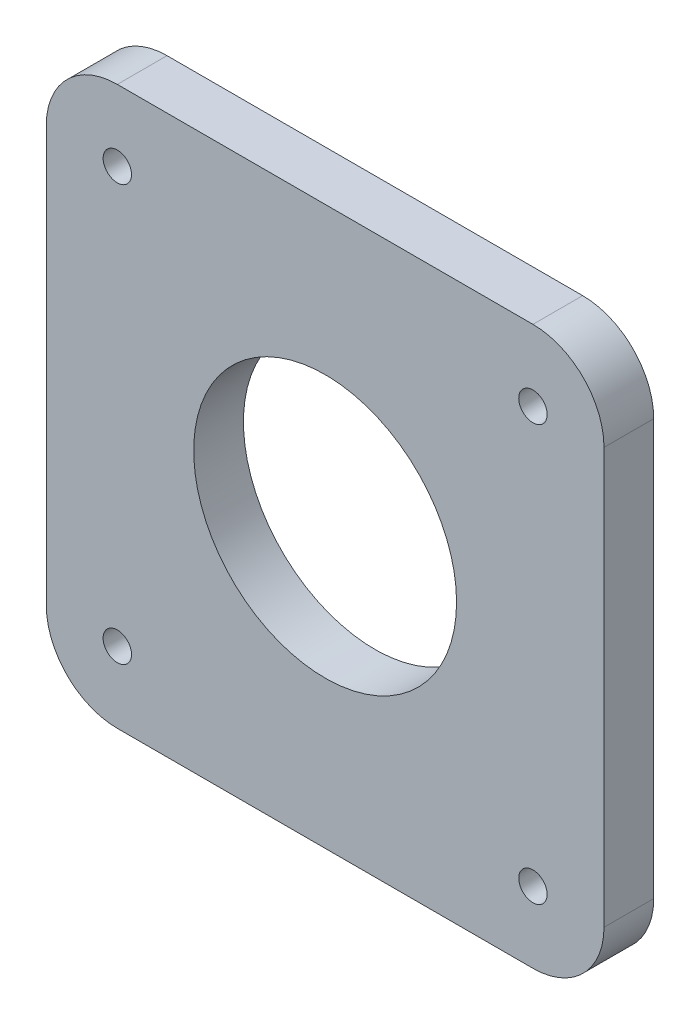
ISO-10303-21;
HEADER;
FILE_DESCRIPTION(('STEP AP214'),'2;1');
FILE_NAME('part.step','',(''),(''),'','','');
FILE_SCHEMA(('AUTOMOTIVE_DESIGN { 1 0 10303 214 1 1 1 1 }'));
ENDSEC;
DATA;
#1=APPLICATION_CONTEXT('core data for automotive mechanical design processes');
#2=APPLICATION_PROTOCOL_DEFINITION('international standard','automotive_design',2000,#1);
#3=PRODUCT_CONTEXT('',#1,'mechanical');
#4=PRODUCT('Part','Part','',(#3));
#5=PRODUCT_RELATED_PRODUCT_CATEGORY('part','',(#4));
#6=PRODUCT_DEFINITION_FORMATION('','',#4);
#7=PRODUCT_DEFINITION_CONTEXT('part definition',#1,'design');
#8=PRODUCT_DEFINITION('design','',#6,#7);
#9=PRODUCT_DEFINITION_SHAPE('','',#8);
#10=(LENGTH_UNIT() NAMED_UNIT(*) SI_UNIT(.MILLI.,.METRE.));
#11=(NAMED_UNIT(*) PLANE_ANGLE_UNIT() SI_UNIT($,.RADIAN.));
#12=(NAMED_UNIT(*) SI_UNIT($,.STERADIAN.) SOLID_ANGLE_UNIT());
#13=UNCERTAINTY_MEASURE_WITH_UNIT(LENGTH_MEASURE(1.E-05),#10,'distance_accuracy_value','');
#14=(GEOMETRIC_REPRESENTATION_CONTEXT(3) GLOBAL_UNCERTAINTY_ASSIGNED_CONTEXT((#13)) GLOBAL_UNIT_ASSIGNED_CONTEXT((#10,
#11,#12)) REPRESENTATION_CONTEXT('',''));
#15=CARTESIAN_POINT('',(0.,0.,0.));
#16=DIRECTION('',(0.,0.,1.));
#17=DIRECTION('',(1.,0.,0.));
#18=AXIS2_PLACEMENT_3D('',#15,#16,#17);
#19=CARTESIAN_POINT('',(39.25,-39.25,3.5));
#20=DIRECTION('',(-1.,0.,0.));
#21=DIRECTION('',(0.,0.,1.));
#22=AXIS2_PLACEMENT_3D('',#19,#20,#21);
#23=PLANE('',#22);
#24=DIRECTION('',(0.,1.,0.));
#25=VECTOR('',#24,1.);
#26=CARTESIAN_POINT('',(39.25,-39.25,3.5));
#27=LINE('',#26,#25);
#28=CARTESIAN_POINT('',(39.25,-29.25,3.5));
#29=VERTEX_POINT('',#28);
#30=CARTESIAN_POINT('',(39.25,29.25,3.5));
#31=VERTEX_POINT('',#30);
#32=EDGE_CURVE('E139',#29,#31,#27,.T.);
#33=ORIENTED_EDGE('',*,*,#32,.F.);
#34=DIRECTION('',(0.,0.,-1.));
#35=VECTOR('',#34,1.);
#36=CARTESIAN_POINT('',(39.25,-29.25,3.5));
#37=LINE('',#36,#35);
#38=CARTESIAN_POINT('',(39.25,-29.25,-3.5));
#39=VERTEX_POINT('',#38);
#40=EDGE_CURVE('E178',#29,#39,#37,.T.);
#41=ORIENTED_EDGE('',*,*,#40,.T.);
#42=DIRECTION('',(0.,1.,0.));
#43=VECTOR('',#42,1.);
#44=CARTESIAN_POINT('',(39.25,-39.25,-3.5));
#45=LINE('',#44,#43);
#46=CARTESIAN_POINT('',(39.25,29.25,-3.5));
#47=VERTEX_POINT('',#46);
#48=EDGE_CURVE('E193',#39,#47,#45,.T.);
#49=ORIENTED_EDGE('',*,*,#48,.T.);
#50=DIRECTION('',(0.,0.,-1.));
#51=VECTOR('',#50,1.);
#52=CARTESIAN_POINT('',(39.25,29.25,3.5));
#53=LINE('',#52,#51);
#54=EDGE_CURVE('E175',#47,#31,#53,.F.);
#55=ORIENTED_EDGE('',*,*,#54,.T.);
#56=EDGE_LOOP('',(#33,#41,#49,#55));
#57=FACE_BOUND('',#56,.T.);
#58=ADVANCED_FACE('F43',(#57),#23,.F.);
#59=CARTESIAN_POINT('',(-39.25,39.25,3.5));
#60=DIRECTION('',(0.,-1.,0.));
#61=DIRECTION('',(0.,0.,-1.));
#62=AXIS2_PLACEMENT_3D('',#59,#60,#61);
#63=PLANE('',#62);
#64=DIRECTION('',(-1.,0.,0.));
#65=VECTOR('',#64,1.);
#66=CARTESIAN_POINT('',(-39.25,39.25,3.5));
#67=LINE('',#66,#65);
#68=CARTESIAN_POINT('',(29.25,39.25,3.5));
#69=VERTEX_POINT('',#68);
#70=CARTESIAN_POINT('',(-29.25,39.25,3.5));
#71=VERTEX_POINT('',#70);
#72=EDGE_CURVE('E144',#69,#71,#67,.T.);
#73=ORIENTED_EDGE('',*,*,#72,.F.);
#74=DIRECTION('',(0.,0.,-1.));
#75=VECTOR('',#74,1.);
#76=CARTESIAN_POINT('',(29.25,39.25,3.5));
#77=LINE('',#76,#75);
#78=CARTESIAN_POINT('',(29.25,39.25,-3.5));
#79=VERTEX_POINT('',#78);
#80=EDGE_CURVE('E11',#69,#79,#77,.T.);
#81=ORIENTED_EDGE('',*,*,#80,.T.);
#82=DIRECTION('',(-1.,0.,0.));
#83=VECTOR('',#82,1.);
#84=CARTESIAN_POINT('',(-39.25,39.25,-3.5));
#85=LINE('',#84,#83);
#86=CARTESIAN_POINT('',(-29.25,39.25,-3.5));
#87=VERTEX_POINT('',#86);
#88=EDGE_CURVE('E146',#79,#87,#85,.T.);
#89=ORIENTED_EDGE('',*,*,#88,.T.);
#90=DIRECTION('',(0.,0.,-1.));
#91=VECTOR('',#90,1.);
#92=CARTESIAN_POINT('',(-29.25,39.25,3.5));
#93=LINE('',#92,#91);
#94=EDGE_CURVE('E52',#87,#71,#93,.F.);
#95=ORIENTED_EDGE('',*,*,#94,.T.);
#96=EDGE_LOOP('',(#73,#81,#89,#95));
#97=FACE_BOUND('',#96,.T.);
#98=ADVANCED_FACE('F199',(#97),#63,.F.);
#99=CARTESIAN_POINT('',(-39.25,-39.25,3.5));
#100=DIRECTION('',(1.,0.,0.));
#101=DIRECTION('',(0.,0.,-1.));
#102=AXIS2_PLACEMENT_3D('',#99,#100,#101);
#103=PLANE('',#102);
#104=DIRECTION('',(0.,-1.,0.));
#105=VECTOR('',#104,1.);
#106=CARTESIAN_POINT('',(-39.25,-39.25,-3.5));
#107=LINE('',#106,#105);
#108=CARTESIAN_POINT('',(-39.25,29.25,-3.5));
#109=VERTEX_POINT('',#108);
#110=CARTESIAN_POINT('',(-39.25,-29.25,-3.5));
#111=VERTEX_POINT('',#110);
#112=EDGE_CURVE('E140',#109,#111,#107,.T.);
#113=ORIENTED_EDGE('',*,*,#112,.T.);
#114=DIRECTION('',(0.,0.,-1.));
#115=VECTOR('',#114,1.);
#116=CARTESIAN_POINT('',(-39.25,-29.25,3.5));
#117=LINE('',#116,#115);
#118=CARTESIAN_POINT('',(-39.25,-29.25,3.5));
#119=VERTEX_POINT('',#118);
#120=EDGE_CURVE('E115',#111,#119,#117,.F.);
#121=ORIENTED_EDGE('',*,*,#120,.T.);
#122=DIRECTION('',(0.,-1.,0.));
#123=VECTOR('',#122,1.);
#124=CARTESIAN_POINT('',(-39.25,-39.25,3.5));
#125=LINE('',#124,#123);
#126=CARTESIAN_POINT('',(-39.25,29.25,3.5));
#127=VERTEX_POINT('',#126);
#128=EDGE_CURVE('E184',#127,#119,#125,.T.);
#129=ORIENTED_EDGE('',*,*,#128,.F.);
#130=DIRECTION('',(0.,0.,-1.));
#131=VECTOR('',#130,1.);
#132=CARTESIAN_POINT('',(-39.25,29.25,3.5));
#133=LINE('',#132,#131);
#134=EDGE_CURVE('E121',#127,#109,#133,.T.);
#135=ORIENTED_EDGE('',*,*,#134,.T.);
#136=EDGE_LOOP('',(#113,#121,#129,#135));
#137=FACE_BOUND('',#136,.T.);
#138=ADVANCED_FACE('F206',(#137),#103,.F.);
#139=CARTESIAN_POINT('',(-39.25,-39.25,3.5));
#140=DIRECTION('',(0.,1.,0.));
#141=DIRECTION('',(0.,0.,1.));
#142=AXIS2_PLACEMENT_3D('',#139,#140,#141);
#143=PLANE('',#142);
#144=DIRECTION('',(1.,0.,0.));
#145=VECTOR('',#144,1.);
#146=CARTESIAN_POINT('',(-39.25,-39.25,3.5));
#147=LINE('',#146,#145);
#148=CARTESIAN_POINT('',(-29.25,-39.25,3.5));
#149=VERTEX_POINT('',#148);
#150=CARTESIAN_POINT('',(29.25,-39.25,3.5));
#151=VERTEX_POINT('',#150);
#152=EDGE_CURVE('E131',#149,#151,#147,.T.);
#153=ORIENTED_EDGE('',*,*,#152,.F.);
#154=DIRECTION('',(0.,0.,-1.));
#155=VECTOR('',#154,1.);
#156=CARTESIAN_POINT('',(-29.25,-39.25,3.5));
#157=LINE('',#156,#155);
#158=CARTESIAN_POINT('',(-29.25,-39.25,-3.5));
#159=VERTEX_POINT('',#158);
#160=EDGE_CURVE('E114',#149,#159,#157,.T.);
#161=ORIENTED_EDGE('',*,*,#160,.T.);
#162=DIRECTION('',(1.,0.,0.));
#163=VECTOR('',#162,1.);
#164=CARTESIAN_POINT('',(-39.25,-39.25,-3.5));
#165=LINE('',#164,#163);
#166=CARTESIAN_POINT('',(29.25,-39.25,-3.5));
#167=VERTEX_POINT('',#166);
#168=EDGE_CURVE('E128',#159,#167,#165,.T.);
#169=ORIENTED_EDGE('',*,*,#168,.T.);
#170=DIRECTION('',(0.,0.,-1.));
#171=VECTOR('',#170,1.);
#172=CARTESIAN_POINT('',(29.25,-39.25,3.5));
#173=LINE('',#172,#171);
#174=EDGE_CURVE('E134',#167,#151,#173,.F.);
#175=ORIENTED_EDGE('',*,*,#174,.T.);
#176=EDGE_LOOP('',(#153,#161,#169,#175));
#177=FACE_BOUND('',#176,.T.);
#178=ADVANCED_FACE('F127',(#177),#143,.F.);
#179=CARTESIAN_POINT('',(0.,0.,3.5));
#180=DIRECTION('',(0.,0.,-1.));
#181=DIRECTION('',(-1.,0.,0.));
#182=AXIS2_PLACEMENT_3D('',#179,#180,#181);
#183=PLANE('',#182);
#184=CARTESIAN_POINT('',(0.,0.,3.5));
#185=DIRECTION('',(0.,0.,1.));
#186=DIRECTION('',(1.,0.,0.));
#187=AXIS2_PLACEMENT_3D('',#184,#185,#186);
#188=CIRCLE('',#187,18.5);
#189=CARTESIAN_POINT('',(18.5,0.,3.5));
#190=VERTEX_POINT('',#189);
#191=EDGE_CURVE('E302',#190,#190,#188,.T.);
#192=ORIENTED_EDGE('',*,*,#191,.F.);
#193=EDGE_LOOP('',(#192));
#194=FACE_BOUND('',#193,.T.);
#195=CARTESIAN_POINT('',(-29.2500000000002,-29.2499999999998,3.5));
#196=DIRECTION('',(0.,0.,1.));
#197=DIRECTION('',(-1.,0.,0.));
#198=AXIS2_PLACEMENT_3D('',#195,#196,#197);
#199=CIRCLE('',#198,2.);
#200=CARTESIAN_POINT('',(-31.2500000000002,-29.2499999999998,3.5));
#201=VERTEX_POINT('',#200);
#202=EDGE_CURVE('E283',#201,#201,#199,.T.);
#203=ORIENTED_EDGE('',*,*,#202,.F.);
#204=EDGE_LOOP('',(#203));
#205=FACE_BOUND('',#204,.T.);
#206=CARTESIAN_POINT('',(29.2500000000002,29.2499999999998,3.5));
#207=DIRECTION('',(0.,0.,1.));
#208=DIRECTION('',(-1.,0.,0.));
#209=AXIS2_PLACEMENT_3D('',#206,#207,#208);
#210=CIRCLE('',#209,2.);
#211=CARTESIAN_POINT('',(27.2500000000002,29.2499999999998,3.5));
#212=VERTEX_POINT('',#211);
#213=EDGE_CURVE('E287',#212,#212,#210,.T.);
#214=ORIENTED_EDGE('',*,*,#213,.F.);
#215=EDGE_LOOP('',(#214));
#216=FACE_BOUND('',#215,.T.);
#217=CARTESIAN_POINT('',(29.2500000000002,-29.2499999999998,3.5));
#218=DIRECTION('',(0.,0.,1.));
#219=DIRECTION('',(1.,0.,0.));
#220=AXIS2_PLACEMENT_3D('',#217,#218,#219);
#221=CIRCLE('',#220,2.);
#222=CARTESIAN_POINT('',(31.2500000000002,-29.2499999999998,3.5));
#223=VERTEX_POINT('',#222);
#224=EDGE_CURVE('E288',#223,#223,#221,.T.);
#225=ORIENTED_EDGE('',*,*,#224,.F.);
#226=EDGE_LOOP('',(#225));
#227=FACE_BOUND('',#226,.T.);
#228=CARTESIAN_POINT('',(-29.2500000000002,29.2499999999998,3.5));
#229=DIRECTION('',(0.,0.,1.));
#230=DIRECTION('',(1.,0.,0.));
#231=AXIS2_PLACEMENT_3D('',#228,#229,#230);
#232=CIRCLE('',#231,2.);
#233=CARTESIAN_POINT('',(-27.2500000000002,29.2499999999998,3.5));
#234=VERTEX_POINT('',#233);
#235=EDGE_CURVE('E279',#234,#234,#232,.T.);
#236=ORIENTED_EDGE('',*,*,#235,.F.);
#237=EDGE_LOOP('',(#236));
#238=FACE_BOUND('',#237,.T.);
#239=ORIENTED_EDGE('',*,*,#128,.T.);
#240=CARTESIAN_POINT('',(-29.25,-29.25,3.5));
#241=DIRECTION('',(0.,0.,-1.));
#242=DIRECTION('',(-1.,0.,0.));
#243=AXIS2_PLACEMENT_3D('',#240,#241,#242);
#244=CIRCLE('',#243,10.);
#245=EDGE_CURVE('E172',#119,#149,#244,.F.);
#246=ORIENTED_EDGE('',*,*,#245,.T.);
#247=ORIENTED_EDGE('',*,*,#152,.T.);
#248=CARTESIAN_POINT('',(29.25,-29.25,3.5));
#249=DIRECTION('',(0.,0.,-1.));
#250=DIRECTION('',(-1.,0.,0.));
#251=AXIS2_PLACEMENT_3D('',#248,#249,#250);
#252=CIRCLE('',#251,10.);
#253=EDGE_CURVE('E169',#151,#29,#252,.F.);
#254=ORIENTED_EDGE('',*,*,#253,.T.);
#255=ORIENTED_EDGE('',*,*,#32,.T.);
#256=CARTESIAN_POINT('',(29.25,29.25,3.5));
#257=DIRECTION('',(0.,0.,-1.));
#258=DIRECTION('',(-1.,0.,0.));
#259=AXIS2_PLACEMENT_3D('',#256,#257,#258);
#260=CIRCLE('',#259,10.);
#261=EDGE_CURVE('E65',#31,#69,#260,.F.);
#262=ORIENTED_EDGE('',*,*,#261,.T.);
#263=ORIENTED_EDGE('',*,*,#72,.T.);
#264=CARTESIAN_POINT('',(-29.25,29.25,3.5));
#265=DIRECTION('',(0.,0.,-1.));
#266=DIRECTION('',(-1.,0.,0.));
#267=AXIS2_PLACEMENT_3D('',#264,#265,#266);
#268=CIRCLE('',#267,10.);
#269=EDGE_CURVE('E164',#71,#127,#268,.F.);
#270=ORIENTED_EDGE('',*,*,#269,.T.);
#271=EDGE_LOOP('',(#239,#246,#247,#254,#255,#262,#263,#270));
#272=FACE_BOUND('',#271,.T.);
#273=ADVANCED_FACE('F204',(#194,#205,#216,#227,#238,#272),#183,.F.);
#274=CARTESIAN_POINT('',(0.,0.,-3.5));
#275=DIRECTION('',(0.,0.,-1.));
#276=DIRECTION('',(-1.,0.,0.));
#277=AXIS2_PLACEMENT_3D('',#274,#275,#276);
#278=PLANE('',#277);
#279=CARTESIAN_POINT('',(0.,0.,-3.5));
#280=DIRECTION('',(0.,0.,1.));
#281=DIRECTION('',(1.,0.,0.));
#282=AXIS2_PLACEMENT_3D('',#279,#280,#281);
#283=CIRCLE('',#282,18.5);
#284=CARTESIAN_POINT('',(18.5,0.,-3.5));
#285=VERTEX_POINT('',#284);
#286=EDGE_CURVE('E264',#285,#285,#283,.T.);
#287=ORIENTED_EDGE('',*,*,#286,.T.);
#288=EDGE_LOOP('',(#287));
#289=FACE_BOUND('',#288,.T.);
#290=CARTESIAN_POINT('',(-29.2500000000002,-29.2499999999998,-3.5));
#291=DIRECTION('',(0.,0.,1.));
#292=DIRECTION('',(-1.,0.,0.));
#293=AXIS2_PLACEMENT_3D('',#290,#291,#292);
#294=CIRCLE('',#293,2.);
#295=CARTESIAN_POINT('',(-31.2500000000002,-29.2499999999998,-3.5));
#296=VERTEX_POINT('',#295);
#297=EDGE_CURVE('E268',#296,#296,#294,.T.);
#298=ORIENTED_EDGE('',*,*,#297,.T.);
#299=EDGE_LOOP('',(#298));
#300=FACE_BOUND('',#299,.T.);
#301=CARTESIAN_POINT('',(29.2500000000002,29.2499999999998,-3.5));
#302=DIRECTION('',(0.,0.,1.));
#303=DIRECTION('',(-1.,0.,0.));
#304=AXIS2_PLACEMENT_3D('',#301,#302,#303);
#305=CIRCLE('',#304,2.);
#306=CARTESIAN_POINT('',(27.2500000000002,29.2499999999998,-3.5));
#307=VERTEX_POINT('',#306);
#308=EDGE_CURVE('E272',#307,#307,#305,.T.);
#309=ORIENTED_EDGE('',*,*,#308,.T.);
#310=EDGE_LOOP('',(#309));
#311=FACE_BOUND('',#310,.T.);
#312=CARTESIAN_POINT('',(29.2500000000002,-29.2499999999998,-3.5));
#313=DIRECTION('',(0.,0.,1.));
#314=DIRECTION('',(1.,0.,0.));
#315=AXIS2_PLACEMENT_3D('',#312,#313,#314);
#316=CIRCLE('',#315,2.);
#317=CARTESIAN_POINT('',(31.2500000000002,-29.2499999999998,-3.5));
#318=VERTEX_POINT('',#317);
#319=EDGE_CURVE('E276',#318,#318,#316,.T.);
#320=ORIENTED_EDGE('',*,*,#319,.T.);
#321=EDGE_LOOP('',(#320));
#322=FACE_BOUND('',#321,.T.);
#323=CARTESIAN_POINT('',(-29.2500000000002,29.2499999999998,-3.5));
#324=DIRECTION('',(0.,0.,1.));
#325=DIRECTION('',(1.,0.,0.));
#326=AXIS2_PLACEMENT_3D('',#323,#324,#325);
#327=CIRCLE('',#326,2.);
#328=CARTESIAN_POINT('',(-27.2500000000002,29.2499999999998,-3.5));
#329=VERTEX_POINT('',#328);
#330=EDGE_CURVE('E196',#329,#329,#327,.T.);
#331=ORIENTED_EDGE('',*,*,#330,.T.);
#332=EDGE_LOOP('',(#331));
#333=FACE_BOUND('',#332,.T.);
#334=ORIENTED_EDGE('',*,*,#168,.F.);
#335=CARTESIAN_POINT('',(-29.25,-29.25,-3.5));
#336=DIRECTION('',(0.,0.,-1.));
#337=DIRECTION('',(-1.,0.,0.));
#338=AXIS2_PLACEMENT_3D('',#335,#336,#337);
#339=CIRCLE('',#338,10.);
#340=EDGE_CURVE('E110',#159,#111,#339,.T.);
#341=ORIENTED_EDGE('',*,*,#340,.T.);
#342=ORIENTED_EDGE('',*,*,#112,.F.);
#343=CARTESIAN_POINT('',(-29.25,29.25,-3.5));
#344=DIRECTION('',(0.,0.,-1.));
#345=DIRECTION('',(-1.,0.,0.));
#346=AXIS2_PLACEMENT_3D('',#343,#344,#345);
#347=CIRCLE('',#346,10.);
#348=EDGE_CURVE('E133',#109,#87,#347,.T.);
#349=ORIENTED_EDGE('',*,*,#348,.T.);
#350=ORIENTED_EDGE('',*,*,#88,.F.);
#351=CARTESIAN_POINT('',(29.25,29.25,-3.5));
#352=DIRECTION('',(0.,0.,-1.));
#353=DIRECTION('',(-1.,0.,0.));
#354=AXIS2_PLACEMENT_3D('',#351,#352,#353);
#355=CIRCLE('',#354,10.);
#356=EDGE_CURVE('E154',#79,#47,#355,.T.);
#357=ORIENTED_EDGE('',*,*,#356,.T.);
#358=ORIENTED_EDGE('',*,*,#48,.F.);
#359=CARTESIAN_POINT('',(29.25,-29.25,-3.5));
#360=DIRECTION('',(0.,0.,-1.));
#361=DIRECTION('',(-1.,0.,0.));
#362=AXIS2_PLACEMENT_3D('',#359,#360,#361);
#363=CIRCLE('',#362,10.);
#364=EDGE_CURVE('E122',#39,#167,#363,.T.);
#365=ORIENTED_EDGE('',*,*,#364,.T.);
#366=EDGE_LOOP('',(#334,#341,#342,#349,#350,#357,#358,#365));
#367=FACE_BOUND('',#366,.T.);
#368=ADVANCED_FACE('F136',(#289,#300,#311,#322,#333,#367),#278,.T.);
#369=CARTESIAN_POINT('',(-29.25,-29.25,3.5));
#370=DIRECTION('',(0.,0.,-1.));
#371=DIRECTION('',(-1.,0.,0.));
#372=AXIS2_PLACEMENT_3D('',#369,#370,#371);
#373=CYLINDRICAL_SURFACE('',#372,10.);
#374=ORIENTED_EDGE('',*,*,#245,.F.);
#375=ORIENTED_EDGE('',*,*,#120,.F.);
#376=ORIENTED_EDGE('',*,*,#340,.F.);
#377=ORIENTED_EDGE('',*,*,#160,.F.);
#378=EDGE_LOOP('',(#374,#375,#376,#377));
#379=FACE_BOUND('',#378,.T.);
#380=ADVANCED_FACE('F113',(#379),#373,.T.);
#381=CARTESIAN_POINT('',(29.25,-29.25,3.5));
#382=DIRECTION('',(0.,0.,-1.));
#383=DIRECTION('',(-1.,0.,0.));
#384=AXIS2_PLACEMENT_3D('',#381,#382,#383);
#385=CYLINDRICAL_SURFACE('',#384,10.);
#386=ORIENTED_EDGE('',*,*,#253,.F.);
#387=ORIENTED_EDGE('',*,*,#174,.F.);
#388=ORIENTED_EDGE('',*,*,#364,.F.);
#389=ORIENTED_EDGE('',*,*,#40,.F.);
#390=EDGE_LOOP('',(#386,#387,#388,#389));
#391=FACE_BOUND('',#390,.T.);
#392=ADVANCED_FACE('F224',(#391),#385,.T.);
#393=CARTESIAN_POINT('',(29.25,29.25,3.5));
#394=DIRECTION('',(0.,0.,-1.));
#395=DIRECTION('',(-1.,0.,0.));
#396=AXIS2_PLACEMENT_3D('',#393,#394,#395);
#397=CYLINDRICAL_SURFACE('',#396,10.);
#398=ORIENTED_EDGE('',*,*,#261,.F.);
#399=ORIENTED_EDGE('',*,*,#54,.F.);
#400=ORIENTED_EDGE('',*,*,#356,.F.);
#401=ORIENTED_EDGE('',*,*,#80,.F.);
#402=EDGE_LOOP('',(#398,#399,#400,#401));
#403=FACE_BOUND('',#402,.T.);
#404=ADVANCED_FACE('F226',(#403),#397,.T.);
#405=CARTESIAN_POINT('',(-29.25,29.25,3.5));
#406=DIRECTION('',(0.,0.,-1.));
#407=DIRECTION('',(-1.,0.,0.));
#408=AXIS2_PLACEMENT_3D('',#405,#406,#407);
#409=CYLINDRICAL_SURFACE('',#408,10.);
#410=ORIENTED_EDGE('',*,*,#269,.F.);
#411=ORIENTED_EDGE('',*,*,#94,.F.);
#412=ORIENTED_EDGE('',*,*,#348,.F.);
#413=ORIENTED_EDGE('',*,*,#134,.F.);
#414=EDGE_LOOP('',(#410,#411,#412,#413));
#415=FACE_BOUND('',#414,.T.);
#416=ADVANCED_FACE('F45',(#415),#409,.T.);
#417=CARTESIAN_POINT('',(-29.2500000000002,29.2499999999998,-3.5));
#418=DIRECTION('',(0.,0.,1.));
#419=DIRECTION('',(1.,0.,0.));
#420=AXIS2_PLACEMENT_3D('',#417,#418,#419);
#421=CYLINDRICAL_SURFACE('',#420,2.);
#422=ORIENTED_EDGE('',*,*,#330,.F.);
#423=EDGE_LOOP('',(#422));
#424=FACE_BOUND('',#423,.T.);
#425=ORIENTED_EDGE('',*,*,#235,.T.);
#426=EDGE_LOOP('',(#425));
#427=FACE_BOUND('',#426,.T.);
#428=ADVANCED_FACE('F233',(#424,#427),#421,.F.);
#429=CARTESIAN_POINT('',(29.2500000000002,-29.2499999999998,-3.5));
#430=DIRECTION('',(0.,0.,1.));
#431=DIRECTION('',(1.,0.,0.));
#432=AXIS2_PLACEMENT_3D('',#429,#430,#431);
#433=CYLINDRICAL_SURFACE('',#432,2.);
#434=ORIENTED_EDGE('',*,*,#319,.F.);
#435=EDGE_LOOP('',(#434));
#436=FACE_BOUND('',#435,.T.);
#437=ORIENTED_EDGE('',*,*,#224,.T.);
#438=EDGE_LOOP('',(#437));
#439=FACE_BOUND('',#438,.T.);
#440=ADVANCED_FACE('F240',(#436,#439),#433,.F.);
#441=CARTESIAN_POINT('',(29.2500000000002,29.2499999999998,-3.5));
#442=DIRECTION('',(0.,0.,1.));
#443=DIRECTION('',(1.,0.,0.));
#444=AXIS2_PLACEMENT_3D('',#441,#442,#443);
#445=CYLINDRICAL_SURFACE('',#444,2.);
#446=ORIENTED_EDGE('',*,*,#308,.F.);
#447=EDGE_LOOP('',(#446));
#448=FACE_BOUND('',#447,.T.);
#449=ORIENTED_EDGE('',*,*,#213,.T.);
#450=EDGE_LOOP('',(#449));
#451=FACE_BOUND('',#450,.T.);
#452=ADVANCED_FACE('F246',(#448,#451),#445,.F.);
#453=CARTESIAN_POINT('',(-29.2500000000002,-29.2499999999998,-3.5));
#454=DIRECTION('',(0.,0.,1.));
#455=DIRECTION('',(1.,0.,0.));
#456=AXIS2_PLACEMENT_3D('',#453,#454,#455);
#457=CYLINDRICAL_SURFACE('',#456,2.);
#458=ORIENTED_EDGE('',*,*,#297,.F.);
#459=EDGE_LOOP('',(#458));
#460=FACE_BOUND('',#459,.T.);
#461=ORIENTED_EDGE('',*,*,#202,.T.);
#462=EDGE_LOOP('',(#461));
#463=FACE_BOUND('',#462,.T.);
#464=ADVANCED_FACE('F321',(#460,#463),#457,.F.);
#465=CARTESIAN_POINT('',(0.,0.,-3.5));
#466=DIRECTION('',(0.,0.,1.));
#467=DIRECTION('',(1.,0.,0.));
#468=AXIS2_PLACEMENT_3D('',#465,#466,#467);
#469=CYLINDRICAL_SURFACE('',#468,18.5);
#470=ORIENTED_EDGE('',*,*,#286,.F.);
#471=EDGE_LOOP('',(#470));
#472=FACE_BOUND('',#471,.T.);
#473=ORIENTED_EDGE('',*,*,#191,.T.);
#474=EDGE_LOOP('',(#473));
#475=FACE_BOUND('',#474,.T.);
#476=ADVANCED_FACE('F309',(#472,#475),#469,.F.);
#477=CLOSED_SHELL('',(#58,#98,#138,#178,#273,#368,#380,#392,#404,#416,#428,#440,#452,#464,#476));
#478=MANIFOLD_SOLID_BREP('B2',#477);
#479=ADVANCED_BREP_SHAPE_REPRESENTATION('',(#18,#478),#14);
#480=SHAPE_DEFINITION_REPRESENTATION(#9,#479);
ENDSEC;
END-ISO-10303-21;
